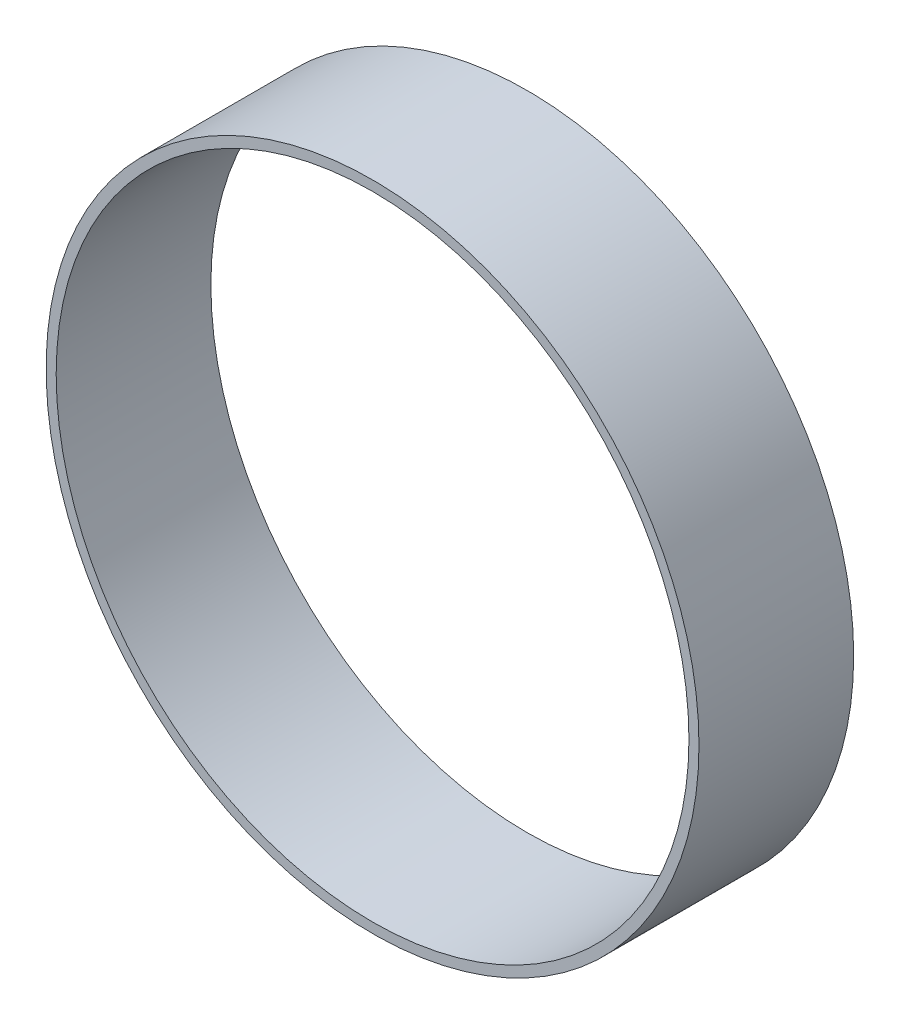
ISO-10303-21;
HEADER;
FILE_DESCRIPTION(('STEP AP214'),'2;1');
FILE_NAME('part.step','',(''),(''),'','','');
FILE_SCHEMA(('AUTOMOTIVE_DESIGN { 1 0 10303 214 1 1 1 1 }'));
ENDSEC;
DATA;
#1=APPLICATION_CONTEXT('core data for automotive mechanical design processes');
#2=APPLICATION_PROTOCOL_DEFINITION('international standard','automotive_design',2000,#1);
#3=PRODUCT_CONTEXT('',#1,'mechanical');
#4=PRODUCT('Part','Part','',(#3));
#5=PRODUCT_RELATED_PRODUCT_CATEGORY('part','',(#4));
#6=PRODUCT_DEFINITION_FORMATION('','',#4);
#7=PRODUCT_DEFINITION_CONTEXT('part definition',#1,'design');
#8=PRODUCT_DEFINITION('design','',#6,#7);
#9=PRODUCT_DEFINITION_SHAPE('','',#8);
#10=(LENGTH_UNIT() NAMED_UNIT(*) SI_UNIT(.MILLI.,.METRE.));
#11=(NAMED_UNIT(*) PLANE_ANGLE_UNIT() SI_UNIT($,.RADIAN.));
#12=(NAMED_UNIT(*) SI_UNIT($,.STERADIAN.) SOLID_ANGLE_UNIT());
#13=UNCERTAINTY_MEASURE_WITH_UNIT(LENGTH_MEASURE(1.E-05),#10,'distance_accuracy_value','');
#14=(GEOMETRIC_REPRESENTATION_CONTEXT(3) GLOBAL_UNCERTAINTY_ASSIGNED_CONTEXT((#13)) GLOBAL_UNIT_ASSIGNED_CONTEXT((#10,
#11,#12)) REPRESENTATION_CONTEXT('',''));
#15=CARTESIAN_POINT('',(0.,0.,0.));
#16=DIRECTION('',(0.,0.,1.));
#17=DIRECTION('',(1.,0.,0.));
#18=AXIS2_PLACEMENT_3D('',#15,#16,#17);
#19=CARTESIAN_POINT('',(0.,0.,0.));
#20=DIRECTION('',(0.,0.,-1.));
#21=DIRECTION('',(1.,0.,0.));
#22=AXIS2_PLACEMENT_3D('',#19,#20,#21);
#23=CYLINDRICAL_SURFACE('',#22,0.8253984);
#24=CARTESIAN_POINT('',(0.,0.,0.39116));
#25=DIRECTION('',(0.,0.,1.));
#26=DIRECTION('',(1.,0.,0.));
#27=AXIS2_PLACEMENT_3D('',#24,#25,#26);
#28=CIRCLE('',#27,0.8253984);
#29=CARTESIAN_POINT('',(0.8253984,0.,0.39116));
#30=VERTEX_POINT('',#29);
#31=EDGE_CURVE('E11',#30,#30,#28,.T.);
#32=ORIENTED_EDGE('',*,*,#31,.F.);
#33=DIRECTION('',(0.,0.,1.));
#34=VECTOR('',#33,1.);
#35=CARTESIAN_POINT('',(0.8253984,0.,0.));
#36=LINE('',#35,#34);
#37=CARTESIAN_POINT('',(0.8253984,0.,0.));
#38=VERTEX_POINT('',#37);
#39=EDGE_CURVE('E23',#38,#30,#36,.T.);
#40=ORIENTED_EDGE('',*,*,#39,.F.);
#41=CARTESIAN_POINT('',(0.,0.,0.));
#42=DIRECTION('',(0.,0.,1.));
#43=DIRECTION('',(1.,0.,0.));
#44=AXIS2_PLACEMENT_3D('',#41,#42,#43);
#45=CIRCLE('',#44,0.8253984);
#46=EDGE_CURVE('E45',#38,#38,#45,.T.);
#47=ORIENTED_EDGE('',*,*,#46,.T.);
#48=ORIENTED_EDGE('',*,*,#39,.T.);
#49=EDGE_LOOP('',(#32,#40,#47,#48));
#50=FACE_BOUND('',#49,.T.);
#51=ADVANCED_FACE('F16',(#50),#23,.T.);
#52=CARTESIAN_POINT('',(0.,0.,0.));
#53=DIRECTION('',(0.,0.,-1.));
#54=DIRECTION('',(1.,0.,0.));
#55=AXIS2_PLACEMENT_3D('',#52,#53,#54);
#56=CYLINDRICAL_SURFACE('',#55,0.7999984);
#57=DIRECTION('',(0.,0.,1.));
#58=VECTOR('',#57,1.);
#59=CARTESIAN_POINT('',(0.7999984,0.,0.));
#60=LINE('',#59,#58);
#61=CARTESIAN_POINT('',(0.7999984,0.,0.));
#62=VERTEX_POINT('',#61);
#63=CARTESIAN_POINT('',(0.7999984,0.,0.39116));
#64=VERTEX_POINT('',#63);
#65=EDGE_CURVE('E39',#62,#64,#60,.T.);
#66=ORIENTED_EDGE('',*,*,#65,.T.);
#67=CARTESIAN_POINT('',(0.,0.,0.39116));
#68=DIRECTION('',(0.,0.,1.));
#69=DIRECTION('',(1.,0.,0.));
#70=AXIS2_PLACEMENT_3D('',#67,#68,#69);
#71=CIRCLE('',#70,0.7999984);
#72=EDGE_CURVE('E44',#64,#64,#71,.T.);
#73=ORIENTED_EDGE('',*,*,#72,.T.);
#74=ORIENTED_EDGE('',*,*,#65,.F.);
#75=CARTESIAN_POINT('',(0.,0.,0.));
#76=DIRECTION('',(0.,0.,1.));
#77=DIRECTION('',(1.,0.,0.));
#78=AXIS2_PLACEMENT_3D('',#75,#76,#77);
#79=CIRCLE('',#78,0.7999984);
#80=EDGE_CURVE('E42',#62,#62,#79,.T.);
#81=ORIENTED_EDGE('',*,*,#80,.F.);
#82=EDGE_LOOP('',(#66,#73,#74,#81));
#83=FACE_BOUND('',#82,.T.);
#84=ADVANCED_FACE('F41',(#83),#56,.F.);
#85=CARTESIAN_POINT('',(0.,0.,0.));
#86=DIRECTION('',(0.,0.,1.));
#87=DIRECTION('',(1.,0.,0.));
#88=AXIS2_PLACEMENT_3D('',#85,#86,#87);
#89=PLANE('',#88);
#90=ORIENTED_EDGE('',*,*,#46,.F.);
#91=EDGE_LOOP('',(#90));
#92=FACE_BOUND('',#91,.T.);
#93=ORIENTED_EDGE('',*,*,#80,.T.);
#94=EDGE_LOOP('',(#93));
#95=FACE_BOUND('',#94,.T.);
#96=ADVANCED_FACE('F48',(#92,#95),#89,.F.);
#97=CARTESIAN_POINT('',(0.,0.,0.39116));
#98=DIRECTION('',(0.,0.,1.));
#99=DIRECTION('',(1.,0.,0.));
#100=AXIS2_PLACEMENT_3D('',#97,#98,#99);
#101=PLANE('',#100);
#102=ORIENTED_EDGE('',*,*,#31,.T.);
#103=EDGE_LOOP('',(#102));
#104=FACE_BOUND('',#103,.T.);
#105=ORIENTED_EDGE('',*,*,#72,.F.);
#106=EDGE_LOOP('',(#105));
#107=FACE_BOUND('',#106,.T.);
#108=ADVANCED_FACE('F55',(#104,#107),#101,.T.);
#109=CLOSED_SHELL('',(#51,#84,#96,#108));
#110=MANIFOLD_SOLID_BREP('B1',#109);
#111=ADVANCED_BREP_SHAPE_REPRESENTATION('',(#18,#110),#14);
#112=SHAPE_DEFINITION_REPRESENTATION(#9,#111);
ENDSEC;
END-ISO-10303-21;
